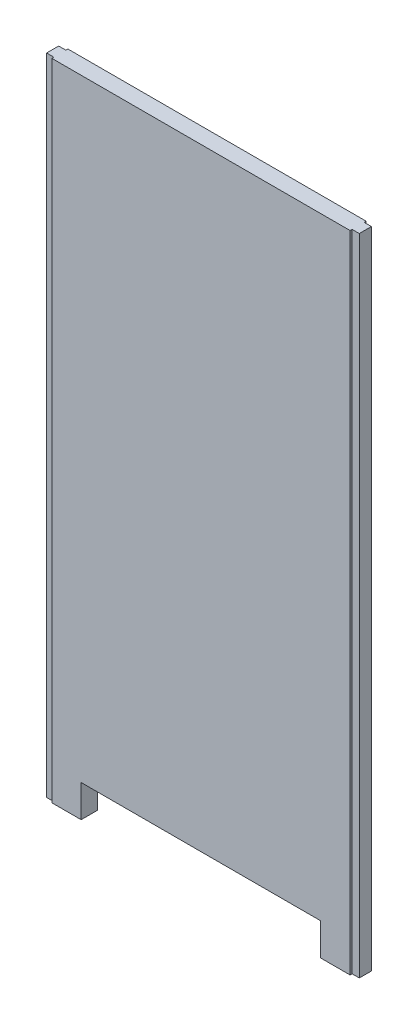
ISO-10303-21;
HEADER;
FILE_DESCRIPTION(('STEP AP214'),'2;1');
FILE_NAME('part.step','',(''),(''),'','','');
FILE_SCHEMA(('AUTOMOTIVE_DESIGN { 1 0 10303 214 1 1 1 1 }'));
ENDSEC;
DATA;
#1=APPLICATION_CONTEXT('core data for automotive mechanical design processes');
#2=APPLICATION_PROTOCOL_DEFINITION('international standard','automotive_design',2000,#1);
#3=PRODUCT_CONTEXT('',#1,'mechanical');
#4=PRODUCT('Part','Part','',(#3));
#5=PRODUCT_RELATED_PRODUCT_CATEGORY('part','',(#4));
#6=PRODUCT_DEFINITION_FORMATION('','',#4);
#7=PRODUCT_DEFINITION_CONTEXT('part definition',#1,'design');
#8=PRODUCT_DEFINITION('design','',#6,#7);
#9=PRODUCT_DEFINITION_SHAPE('','',#8);
#10=(LENGTH_UNIT() NAMED_UNIT(*) SI_UNIT(.MILLI.,.METRE.));
#11=(NAMED_UNIT(*) PLANE_ANGLE_UNIT() SI_UNIT($,.RADIAN.));
#12=(NAMED_UNIT(*) SI_UNIT($,.STERADIAN.) SOLID_ANGLE_UNIT());
#13=UNCERTAINTY_MEASURE_WITH_UNIT(LENGTH_MEASURE(1.E-05),#10,'distance_accuracy_value','');
#14=(GEOMETRIC_REPRESENTATION_CONTEXT(3) GLOBAL_UNCERTAINTY_ASSIGNED_CONTEXT((#13)) GLOBAL_UNIT_ASSIGNED_CONTEXT((#10,
#11,#12)) REPRESENTATION_CONTEXT('',''));
#15=CARTESIAN_POINT('',(0.,0.,0.));
#16=DIRECTION('',(0.,0.,1.));
#17=DIRECTION('',(1.,0.,0.));
#18=AXIS2_PLACEMENT_3D('',#15,#16,#17);
#19=CARTESIAN_POINT('',(0.,0.,2.));
#20=DIRECTION('',(0.,1.,0.));
#21=DIRECTION('',(0.,0.,1.));
#22=AXIS2_PLACEMENT_3D('',#19,#20,#21);
#23=PLANE('',#22);
#24=DIRECTION('',(0.,0.,1.));
#25=VECTOR('',#24,1.);
#26=CARTESIAN_POINT('',(33.3634572036821,0.,-29.9948235564531));
#27=LINE('',#26,#25);
#28=CARTESIAN_POINT('',(33.3634572036821,0.,0.));
#29=VERTEX_POINT('',#28);
#30=CARTESIAN_POINT('',(33.3634572036821,0.,2.));
#31=VERTEX_POINT('',#30);
#32=EDGE_CURVE('E160',#29,#31,#27,.T.);
#33=ORIENTED_EDGE('',*,*,#32,.F.);
#34=DIRECTION('',(1.,0.,0.));
#35=VECTOR('',#34,1.);
#36=CARTESIAN_POINT('',(0.,0.,0.));
#37=LINE('',#36,#35);
#38=CARTESIAN_POINT('',(37.,0.,0.));
#39=VERTEX_POINT('',#38);
#40=EDGE_CURVE('E173',#29,#39,#37,.T.);
#41=ORIENTED_EDGE('',*,*,#40,.T.);
#42=DIRECTION('',(0.,0.,-1.));
#43=VECTOR('',#42,1.);
#44=CARTESIAN_POINT('',(37.,0.,2.));
#45=LINE('',#44,#43);
#46=CARTESIAN_POINT('',(37.,0.,0.25));
#47=VERTEX_POINT('',#46);
#48=EDGE_CURVE('E212',#47,#39,#45,.T.);
#49=ORIENTED_EDGE('',*,*,#48,.F.);
#50=DIRECTION('',(1.,0.,0.));
#51=VECTOR('',#50,1.);
#52=CARTESIAN_POINT('',(0.,0.,0.250000000000009));
#53=LINE('',#52,#51);
#54=CARTESIAN_POINT('',(37.9,0.,0.25));
#55=VERTEX_POINT('',#54);
#56=EDGE_CURVE('E225',#47,#55,#53,.T.);
#57=ORIENTED_EDGE('',*,*,#56,.T.);
#58=DIRECTION('',(0.,0.,1.));
#59=VECTOR('',#58,1.);
#60=CARTESIAN_POINT('',(37.9,0.,0.));
#61=LINE('',#60,#59);
#62=CARTESIAN_POINT('',(37.9,0.,1.75));
#63=VERTEX_POINT('',#62);
#64=EDGE_CURVE('E228',#55,#63,#61,.T.);
#65=ORIENTED_EDGE('',*,*,#64,.T.);
#66=DIRECTION('',(1.,0.,0.));
#67=VECTOR('',#66,1.);
#68=CARTESIAN_POINT('',(0.,0.,1.74999999999999));
#69=LINE('',#68,#67);
#70=CARTESIAN_POINT('',(37.,0.,1.75));
#71=VERTEX_POINT('',#70);
#72=EDGE_CURVE('E233',#71,#63,#69,.T.);
#73=ORIENTED_EDGE('',*,*,#72,.F.);
#74=CARTESIAN_POINT('',(37.,0.,2.));
#75=VERTEX_POINT('',#74);
#76=EDGE_CURVE('E213',#75,#71,#45,.T.);
#77=ORIENTED_EDGE('',*,*,#76,.F.);
#78=DIRECTION('',(1.,0.,0.));
#79=VECTOR('',#78,1.);
#80=CARTESIAN_POINT('',(0.,0.,2.));
#81=LINE('',#80,#79);
#82=EDGE_CURVE('E176',#31,#75,#81,.T.);
#83=ORIENTED_EDGE('',*,*,#82,.F.);
#84=EDGE_LOOP('',(#33,#41,#49,#57,#65,#73,#77,#83));
#85=FACE_BOUND('',#84,.T.);
#86=ADVANCED_FACE('F41',(#85),#23,.F.);
#87=CARTESIAN_POINT('',(0.,0.,2.));
#88=DIRECTION('',(0.,0.,-1.));
#89=DIRECTION('',(-1.,0.,0.));
#90=AXIS2_PLACEMENT_3D('',#87,#88,#89);
#91=PLANE('',#90);
#92=DIRECTION('',(0.,-1.,0.));
#93=VECTOR('',#92,1.);
#94=CARTESIAN_POINT('',(33.3634572036821,4.,2.));
#95=LINE('',#94,#93);
#96=CARTESIAN_POINT('',(33.3634572036821,4.,2.));
#97=VERTEX_POINT('',#96);
#98=EDGE_CURVE('E346',#97,#31,#95,.T.);
#99=ORIENTED_EDGE('',*,*,#98,.T.);
#100=ORIENTED_EDGE('',*,*,#82,.T.);
#101=DIRECTION('',(0.,1.,0.));
#102=VECTOR('',#101,1.);
#103=CARTESIAN_POINT('',(37.,0.,2.));
#104=LINE('',#103,#102);
#105=CARTESIAN_POINT('',(37.,80.,2.));
#106=VERTEX_POINT('',#105);
#107=EDGE_CURVE('E310',#75,#106,#104,.T.);
#108=ORIENTED_EDGE('',*,*,#107,.T.);
#109=DIRECTION('',(-1.,0.,0.));
#110=VECTOR('',#109,1.);
#111=CARTESIAN_POINT('',(0.,80.,2.));
#112=LINE('',#111,#110);
#113=CARTESIAN_POINT('',(0.,80.,2.));
#114=VERTEX_POINT('',#113);
#115=EDGE_CURVE('E312',#106,#114,#112,.T.);
#116=ORIENTED_EDGE('',*,*,#115,.T.);
#117=DIRECTION('',(0.,-1.,0.));
#118=VECTOR('',#117,1.);
#119=CARTESIAN_POINT('',(0.,0.,2.));
#120=LINE('',#119,#118);
#121=CARTESIAN_POINT('',(0.,0.,2.));
#122=VERTEX_POINT('',#121);
#123=EDGE_CURVE('E202',#114,#122,#120,.T.);
#124=ORIENTED_EDGE('',*,*,#123,.T.);
#125=CARTESIAN_POINT('',(3.63654279631794,0.,2.));
#126=VERTEX_POINT('',#125);
#127=EDGE_CURVE('E306',#122,#126,#81,.T.);
#128=ORIENTED_EDGE('',*,*,#127,.T.);
#129=DIRECTION('',(0.,-1.,0.));
#130=VECTOR('',#129,1.);
#131=CARTESIAN_POINT('',(3.63654279631794,4.,2.));
#132=LINE('',#131,#130);
#133=CARTESIAN_POINT('',(3.63654279631794,4.,2.));
#134=VERTEX_POINT('',#133);
#135=EDGE_CURVE('E167',#134,#126,#132,.T.);
#136=ORIENTED_EDGE('',*,*,#135,.F.);
#137=DIRECTION('',(1.,0.,0.));
#138=VECTOR('',#137,1.);
#139=CARTESIAN_POINT('',(3.63654279631794,4.,2.));
#140=LINE('',#139,#138);
#141=EDGE_CURVE('E510',#134,#97,#140,.T.);
#142=ORIENTED_EDGE('',*,*,#141,.T.);
#143=EDGE_LOOP('',(#99,#100,#108,#116,#124,#128,#136,#142));
#144=FACE_BOUND('',#143,.T.);
#145=ADVANCED_FACE('F344',(#144),#91,.F.);
#146=CARTESIAN_POINT('',(0.,0.,0.));
#147=DIRECTION('',(0.,0.,-1.));
#148=DIRECTION('',(-1.,0.,0.));
#149=AXIS2_PLACEMENT_3D('',#146,#147,#148);
#150=PLANE('',#149);
#151=ORIENTED_EDGE('',*,*,#40,.F.);
#152=DIRECTION('',(0.,-1.,0.));
#153=VECTOR('',#152,1.);
#154=CARTESIAN_POINT('',(33.3634572036821,4.,0.));
#155=LINE('',#154,#153);
#156=CARTESIAN_POINT('',(33.3634572036821,4.,0.));
#157=VERTEX_POINT('',#156);
#158=EDGE_CURVE('E156',#157,#29,#155,.T.);
#159=ORIENTED_EDGE('',*,*,#158,.F.);
#160=DIRECTION('',(1.,0.,0.));
#161=VECTOR('',#160,1.);
#162=CARTESIAN_POINT('',(3.63654279631794,4.,0.));
#163=LINE('',#162,#161);
#164=CARTESIAN_POINT('',(3.63654279631794,4.,0.));
#165=VERTEX_POINT('',#164);
#166=EDGE_CURVE('E168',#165,#157,#163,.T.);
#167=ORIENTED_EDGE('',*,*,#166,.F.);
#168=DIRECTION('',(0.,-1.,0.));
#169=VECTOR('',#168,1.);
#170=CARTESIAN_POINT('',(3.63654279631794,4.,0.));
#171=LINE('',#170,#169);
#172=CARTESIAN_POINT('',(3.63654279631794,0.,0.));
#173=VERTEX_POINT('',#172);
#174=EDGE_CURVE('E253',#165,#173,#171,.T.);
#175=ORIENTED_EDGE('',*,*,#174,.T.);
#176=CARTESIAN_POINT('',(0.,0.,0.));
#177=VERTEX_POINT('',#176);
#178=EDGE_CURVE('E185',#177,#173,#37,.T.);
#179=ORIENTED_EDGE('',*,*,#178,.F.);
#180=DIRECTION('',(0.,-1.,0.));
#181=VECTOR('',#180,1.);
#182=CARTESIAN_POINT('',(0.,0.,0.));
#183=LINE('',#182,#181);
#184=CARTESIAN_POINT('',(0.,80.,0.));
#185=VERTEX_POINT('',#184);
#186=EDGE_CURVE('E186',#185,#177,#183,.T.);
#187=ORIENTED_EDGE('',*,*,#186,.F.);
#188=DIRECTION('',(-1.,0.,0.));
#189=VECTOR('',#188,1.);
#190=CARTESIAN_POINT('',(0.,80.,0.));
#191=LINE('',#190,#189);
#192=CARTESIAN_POINT('',(37.,80.,0.));
#193=VERTEX_POINT('',#192);
#194=EDGE_CURVE('E198',#193,#185,#191,.T.);
#195=ORIENTED_EDGE('',*,*,#194,.F.);
#196=DIRECTION('',(0.,1.,0.));
#197=VECTOR('',#196,1.);
#198=CARTESIAN_POINT('',(37.,0.,0.));
#199=LINE('',#198,#197);
#200=EDGE_CURVE('E183',#39,#193,#199,.T.);
#201=ORIENTED_EDGE('',*,*,#200,.F.);
#202=EDGE_LOOP('',(#151,#159,#167,#175,#179,#187,#195,#201));
#203=FACE_BOUND('',#202,.T.);
#204=ADVANCED_FACE('F180',(#203),#150,.T.);
#205=CARTESIAN_POINT('',(37.,0.,2.));
#206=DIRECTION('',(-1.,0.,0.));
#207=DIRECTION('',(0.,0.,1.));
#208=AXIS2_PLACEMENT_3D('',#205,#206,#207);
#209=PLANE('',#208);
#210=DIRECTION('',(0.,1.,0.));
#211=VECTOR('',#210,1.);
#212=CARTESIAN_POINT('',(37.,-1.74928556845358,0.25));
#213=LINE('',#212,#211);
#214=CARTESIAN_POINT('',(37.,80.,0.25));
#215=VERTEX_POINT('',#214);
#216=EDGE_CURVE('E224',#47,#215,#213,.T.);
#217=ORIENTED_EDGE('',*,*,#216,.F.);
#218=ORIENTED_EDGE('',*,*,#48,.T.);
#219=ORIENTED_EDGE('',*,*,#200,.T.);
#220=DIRECTION('',(0.,0.,-1.));
#221=VECTOR('',#220,1.);
#222=CARTESIAN_POINT('',(37.,80.,2.));
#223=LINE('',#222,#221);
#224=EDGE_CURVE('E207',#215,#193,#223,.T.);
#225=ORIENTED_EDGE('',*,*,#224,.F.);
#226=EDGE_LOOP('',(#217,#218,#219,#225));
#227=FACE_BOUND('',#226,.T.);
#228=ADVANCED_FACE('F222',(#227),#209,.F.);
#229=CARTESIAN_POINT('',(0.,0.,2.));
#230=DIRECTION('',(1.,0.,0.));
#231=DIRECTION('',(0.,0.,-1.));
#232=AXIS2_PLACEMENT_3D('',#229,#230,#231);
#233=PLANE('',#232);
#234=DIRECTION('',(0.,1.,0.));
#235=VECTOR('',#234,1.);
#236=CARTESIAN_POINT('',(0.,-1.74928556845358,1.75));
#237=LINE('',#236,#235);
#238=CARTESIAN_POINT('',(0.,0.,1.75));
#239=VERTEX_POINT('',#238);
#240=CARTESIAN_POINT('',(0.,80.,1.75));
#241=VERTEX_POINT('',#240);
#242=EDGE_CURVE('E292',#239,#241,#237,.T.);
#243=ORIENTED_EDGE('',*,*,#242,.F.);
#244=DIRECTION('',(0.,0.,-1.));
#245=VECTOR('',#244,1.);
#246=CARTESIAN_POINT('',(0.,0.,2.));
#247=LINE('',#246,#245);
#248=EDGE_CURVE('E11',#122,#239,#247,.T.);
#249=ORIENTED_EDGE('',*,*,#248,.F.);
#250=ORIENTED_EDGE('',*,*,#123,.F.);
#251=DIRECTION('',(0.,0.,-1.));
#252=VECTOR('',#251,1.);
#253=CARTESIAN_POINT('',(0.,80.,2.));
#254=LINE('',#253,#252);
#255=EDGE_CURVE('E203',#114,#241,#254,.T.);
#256=ORIENTED_EDGE('',*,*,#255,.T.);
#257=EDGE_LOOP('',(#243,#249,#250,#256));
#258=FACE_BOUND('',#257,.T.);
#259=ADVANCED_FACE('F341',(#258),#233,.F.);
#260=CARTESIAN_POINT('',(0.,0.,0.25));
#261=VERTEX_POINT('',#260);
#262=EDGE_CURVE('E50',#261,#177,#247,.T.);
#263=ORIENTED_EDGE('',*,*,#262,.F.);
#264=DIRECTION('',(0.,1.,0.));
#265=VECTOR('',#264,1.);
#266=CARTESIAN_POINT('',(0.,-1.74928556845358,0.25));
#267=LINE('',#266,#265);
#268=CARTESIAN_POINT('',(0.,80.,0.25));
#269=VERTEX_POINT('',#268);
#270=EDGE_CURVE('E288',#261,#269,#267,.T.);
#271=ORIENTED_EDGE('',*,*,#270,.T.);
#272=EDGE_CURVE('E208',#269,#185,#254,.T.);
#273=ORIENTED_EDGE('',*,*,#272,.T.);
#274=ORIENTED_EDGE('',*,*,#186,.T.);
#275=EDGE_LOOP('',(#263,#271,#273,#274));
#276=FACE_BOUND('',#275,.T.);
#277=ADVANCED_FACE('F43',(#276),#233,.F.);
#278=ORIENTED_EDGE('',*,*,#178,.T.);
#279=DIRECTION('',(0.,0.,1.));
#280=VECTOR('',#279,1.);
#281=CARTESIAN_POINT('',(3.63654279631794,0.,-29.9948235564531));
#282=LINE('',#281,#280);
#283=EDGE_CURVE('E57',#173,#126,#282,.T.);
#284=ORIENTED_EDGE('',*,*,#283,.T.);
#285=ORIENTED_EDGE('',*,*,#127,.F.);
#286=ORIENTED_EDGE('',*,*,#248,.T.);
#287=DIRECTION('',(-1.,0.,0.));
#288=VECTOR('',#287,1.);
#289=CARTESIAN_POINT('',(0.,0.,1.75));
#290=LINE('',#289,#288);
#291=CARTESIAN_POINT('',(-0.9,0.,1.75));
#292=VERTEX_POINT('',#291);
#293=EDGE_CURVE('E270',#239,#292,#290,.T.);
#294=ORIENTED_EDGE('',*,*,#293,.T.);
#295=DIRECTION('',(0.,0.,1.));
#296=VECTOR('',#295,1.);
#297=CARTESIAN_POINT('',(-0.9,0.,0.));
#298=LINE('',#297,#296);
#299=CARTESIAN_POINT('',(-0.9,0.,0.25));
#300=VERTEX_POINT('',#299);
#301=EDGE_CURVE('E273',#300,#292,#298,.T.);
#302=ORIENTED_EDGE('',*,*,#301,.F.);
#303=DIRECTION('',(-1.,0.,0.));
#304=VECTOR('',#303,1.);
#305=CARTESIAN_POINT('',(0.,0.,0.25));
#306=LINE('',#305,#304);
#307=EDGE_CURVE('E192',#261,#300,#306,.T.);
#308=ORIENTED_EDGE('',*,*,#307,.F.);
#309=ORIENTED_EDGE('',*,*,#262,.T.);
#310=EDGE_LOOP('',(#278,#284,#285,#286,#294,#302,#308,#309));
#311=FACE_BOUND('',#310,.T.);
#312=ADVANCED_FACE('F328',(#311),#23,.F.);
#313=ORIENTED_EDGE('',*,*,#76,.T.);
#314=DIRECTION('',(0.,1.,0.));
#315=VECTOR('',#314,1.);
#316=CARTESIAN_POINT('',(37.,-1.74928556845358,1.75));
#317=LINE('',#316,#315);
#318=CARTESIAN_POINT('',(37.,80.,1.75));
#319=VERTEX_POINT('',#318);
#320=EDGE_CURVE('E232',#71,#319,#317,.T.);
#321=ORIENTED_EDGE('',*,*,#320,.T.);
#322=EDGE_CURVE('E209',#106,#319,#223,.T.);
#323=ORIENTED_EDGE('',*,*,#322,.F.);
#324=ORIENTED_EDGE('',*,*,#107,.F.);
#325=EDGE_LOOP('',(#313,#321,#323,#324));
#326=FACE_BOUND('',#325,.T.);
#327=ADVANCED_FACE('F361',(#326),#209,.F.);
#328=CARTESIAN_POINT('',(0.,80.,2.));
#329=DIRECTION('',(0.,-1.,0.));
#330=DIRECTION('',(0.,0.,-1.));
#331=AXIS2_PLACEMENT_3D('',#328,#329,#330);
#332=PLANE('',#331);
#333=ORIENTED_EDGE('',*,*,#194,.T.);
#334=ORIENTED_EDGE('',*,*,#272,.F.);
#335=DIRECTION('',(1.,0.,0.));
#336=VECTOR('',#335,1.);
#337=CARTESIAN_POINT('',(0.,80.,0.25));
#338=LINE('',#337,#336);
#339=CARTESIAN_POINT('',(-0.9,80.,0.25));
#340=VERTEX_POINT('',#339);
#341=EDGE_CURVE('E268',#340,#269,#338,.T.);
#342=ORIENTED_EDGE('',*,*,#341,.F.);
#343=DIRECTION('',(0.,0.,-1.));
#344=VECTOR('',#343,1.);
#345=CARTESIAN_POINT('',(-0.9,80.,0.));
#346=LINE('',#345,#344);
#347=CARTESIAN_POINT('',(-0.9,80.,1.75));
#348=VERTEX_POINT('',#347);
#349=EDGE_CURVE('E279',#348,#340,#346,.T.);
#350=ORIENTED_EDGE('',*,*,#349,.F.);
#351=DIRECTION('',(1.,0.,0.));
#352=VECTOR('',#351,1.);
#353=CARTESIAN_POINT('',(0.,80.,1.75));
#354=LINE('',#353,#352);
#355=EDGE_CURVE('E283',#348,#241,#354,.T.);
#356=ORIENTED_EDGE('',*,*,#355,.T.);
#357=ORIENTED_EDGE('',*,*,#255,.F.);
#358=ORIENTED_EDGE('',*,*,#115,.F.);
#359=ORIENTED_EDGE('',*,*,#322,.T.);
#360=DIRECTION('',(-1.,0.,0.));
#361=VECTOR('',#360,1.);
#362=CARTESIAN_POINT('',(0.,80.,1.74999999999999));
#363=LINE('',#362,#361);
#364=CARTESIAN_POINT('',(37.9,80.,1.75));
#365=VERTEX_POINT('',#364);
#366=EDGE_CURVE('E65',#365,#319,#363,.T.);
#367=ORIENTED_EDGE('',*,*,#366,.F.);
#368=DIRECTION('',(0.,0.,-1.));
#369=VECTOR('',#368,1.);
#370=CARTESIAN_POINT('',(37.9,80.,0.));
#371=LINE('',#370,#369);
#372=CARTESIAN_POINT('',(37.9,80.,0.25));
#373=VERTEX_POINT('',#372);
#374=EDGE_CURVE('E264',#365,#373,#371,.T.);
#375=ORIENTED_EDGE('',*,*,#374,.T.);
#376=DIRECTION('',(-1.,0.,0.));
#377=VECTOR('',#376,1.);
#378=CARTESIAN_POINT('',(0.,80.,0.250000000000009));
#379=LINE('',#378,#377);
#380=EDGE_CURVE('E239',#373,#215,#379,.T.);
#381=ORIENTED_EDGE('',*,*,#380,.T.);
#382=ORIENTED_EDGE('',*,*,#224,.T.);
#383=EDGE_LOOP('',(#333,#334,#342,#350,#356,#357,#358,#359,#367,#375,#381,#382));
#384=FACE_BOUND('',#383,.T.);
#385=ADVANCED_FACE('F325',(#384),#332,.F.);
#386=CARTESIAN_POINT('',(-0.9,-1.74928556845358,0.));
#387=DIRECTION('',(1.,0.,0.));
#388=DIRECTION('',(0.,0.,-1.));
#389=AXIS2_PLACEMENT_3D('',#386,#387,#388);
#390=PLANE('',#389);
#391=DIRECTION('',(0.,1.,0.));
#392=VECTOR('',#391,1.);
#393=CARTESIAN_POINT('',(-0.9,-1.74928556845358,0.25));
#394=LINE('',#393,#392);
#395=EDGE_CURVE('E287',#300,#340,#394,.T.);
#396=ORIENTED_EDGE('',*,*,#395,.F.);
#397=ORIENTED_EDGE('',*,*,#301,.T.);
#398=DIRECTION('',(0.,1.,0.));
#399=VECTOR('',#398,1.);
#400=CARTESIAN_POINT('',(-0.9,-1.74928556845358,1.75));
#401=LINE('',#400,#399);
#402=EDGE_CURVE('E295',#292,#348,#401,.T.);
#403=ORIENTED_EDGE('',*,*,#402,.T.);
#404=ORIENTED_EDGE('',*,*,#349,.T.);
#405=EDGE_LOOP('',(#396,#397,#403,#404));
#406=FACE_BOUND('',#405,.T.);
#407=ADVANCED_FACE('F360',(#406),#390,.F.);
#408=CARTESIAN_POINT('',(0.,-1.74928556845358,1.75));
#409=DIRECTION('',(0.,0.,1.));
#410=DIRECTION('',(1.,0.,0.));
#411=AXIS2_PLACEMENT_3D('',#408,#409,#410);
#412=PLANE('',#411);
#413=ORIENTED_EDGE('',*,*,#293,.F.);
#414=ORIENTED_EDGE('',*,*,#242,.T.);
#415=ORIENTED_EDGE('',*,*,#355,.F.);
#416=ORIENTED_EDGE('',*,*,#402,.F.);
#417=EDGE_LOOP('',(#413,#414,#415,#416));
#418=FACE_BOUND('',#417,.T.);
#419=ADVANCED_FACE('F337',(#418),#412,.T.);
#420=CARTESIAN_POINT('',(0.,-1.74928556845358,0.25));
#421=DIRECTION('',(0.,0.,1.));
#422=DIRECTION('',(1.,0.,0.));
#423=AXIS2_PLACEMENT_3D('',#420,#421,#422);
#424=PLANE('',#423);
#425=ORIENTED_EDGE('',*,*,#270,.F.);
#426=ORIENTED_EDGE('',*,*,#307,.T.);
#427=ORIENTED_EDGE('',*,*,#395,.T.);
#428=ORIENTED_EDGE('',*,*,#341,.T.);
#429=EDGE_LOOP('',(#425,#426,#427,#428));
#430=FACE_BOUND('',#429,.T.);
#431=ADVANCED_FACE('F331',(#430),#424,.F.);
#432=CARTESIAN_POINT('',(0.,-1.74928556845358,1.74999999999999));
#433=DIRECTION('',(0.,0.,-1.));
#434=DIRECTION('',(-1.,0.,0.));
#435=AXIS2_PLACEMENT_3D('',#432,#433,#434);
#436=PLANE('',#435);
#437=ORIENTED_EDGE('',*,*,#320,.F.);
#438=ORIENTED_EDGE('',*,*,#72,.T.);
#439=DIRECTION('',(0.,1.,0.));
#440=VECTOR('',#439,1.);
#441=CARTESIAN_POINT('',(37.9,-1.74928556845358,1.75));
#442=LINE('',#441,#440);
#443=EDGE_CURVE('E244',#63,#365,#442,.T.);
#444=ORIENTED_EDGE('',*,*,#443,.T.);
#445=ORIENTED_EDGE('',*,*,#366,.T.);
#446=EDGE_LOOP('',(#437,#438,#444,#445));
#447=FACE_BOUND('',#446,.T.);
#448=ADVANCED_FACE('F414',(#447),#436,.F.);
#449=CARTESIAN_POINT('',(0.,-1.74928556845358,0.250000000000009));
#450=DIRECTION('',(0.,0.,-1.));
#451=DIRECTION('',(-1.,0.,0.));
#452=AXIS2_PLACEMENT_3D('',#449,#450,#451);
#453=PLANE('',#452);
#454=ORIENTED_EDGE('',*,*,#56,.F.);
#455=ORIENTED_EDGE('',*,*,#216,.T.);
#456=ORIENTED_EDGE('',*,*,#380,.F.);
#457=DIRECTION('',(0.,1.,0.));
#458=VECTOR('',#457,1.);
#459=CARTESIAN_POINT('',(37.9,-1.74928556845358,0.25));
#460=LINE('',#459,#458);
#461=EDGE_CURVE('E236',#55,#373,#460,.T.);
#462=ORIENTED_EDGE('',*,*,#461,.F.);
#463=EDGE_LOOP('',(#454,#455,#456,#462));
#464=FACE_BOUND('',#463,.T.);
#465=ADVANCED_FACE('F237',(#464),#453,.T.);
#466=CARTESIAN_POINT('',(37.9,-1.74928556845358,0.));
#467=DIRECTION('',(1.,0.,0.));
#468=DIRECTION('',(0.,0.,-1.));
#469=AXIS2_PLACEMENT_3D('',#466,#467,#468);
#470=PLANE('',#469);
#471=ORIENTED_EDGE('',*,*,#64,.F.);
#472=ORIENTED_EDGE('',*,*,#461,.T.);
#473=ORIENTED_EDGE('',*,*,#374,.F.);
#474=ORIENTED_EDGE('',*,*,#443,.F.);
#475=EDGE_LOOP('',(#471,#472,#473,#474));
#476=FACE_BOUND('',#475,.T.);
#477=ADVANCED_FACE('F247',(#476),#470,.T.);
#478=CARTESIAN_POINT('',(33.3634572036821,4.,-29.9948235564531));
#479=DIRECTION('',(-1.,0.,0.));
#480=DIRECTION('',(0.,0.,1.));
#481=AXIS2_PLACEMENT_3D('',#478,#479,#480);
#482=PLANE('',#481);
#483=ORIENTED_EDGE('',*,*,#158,.T.);
#484=ORIENTED_EDGE('',*,*,#32,.T.);
#485=ORIENTED_EDGE('',*,*,#98,.F.);
#486=DIRECTION('',(0.,0.,1.));
#487=VECTOR('',#486,1.);
#488=CARTESIAN_POINT('',(33.3634572036821,4.,-29.9948235564531));
#489=LINE('',#488,#487);
#490=EDGE_CURVE('E162',#157,#97,#489,.T.);
#491=ORIENTED_EDGE('',*,*,#490,.F.);
#492=EDGE_LOOP('',(#483,#484,#485,#491));
#493=FACE_BOUND('',#492,.T.);
#494=ADVANCED_FACE('F158',(#493),#482,.T.);
#495=CARTESIAN_POINT('',(3.63654279631794,4.,-29.9948235564531));
#496=DIRECTION('',(0.,-1.,0.));
#497=DIRECTION('',(0.,0.,-1.));
#498=AXIS2_PLACEMENT_3D('',#495,#496,#497);
#499=PLANE('',#498);
#500=ORIENTED_EDGE('',*,*,#166,.T.);
#501=ORIENTED_EDGE('',*,*,#490,.T.);
#502=ORIENTED_EDGE('',*,*,#141,.F.);
#503=DIRECTION('',(0.,0.,1.));
#504=VECTOR('',#503,1.);
#505=CARTESIAN_POINT('',(3.63654279631794,4.,-29.9948235564531));
#506=LINE('',#505,#504);
#507=EDGE_CURVE('E507',#165,#134,#506,.T.);
#508=ORIENTED_EDGE('',*,*,#507,.F.);
#509=EDGE_LOOP('',(#500,#501,#502,#508));
#510=FACE_BOUND('',#509,.T.);
#511=ADVANCED_FACE('F484',(#510),#499,.T.);
#512=CARTESIAN_POINT('',(3.63654279631794,4.,-29.9948235564531));
#513=DIRECTION('',(-1.,0.,0.));
#514=DIRECTION('',(0.,-1.,0.));
#515=AXIS2_PLACEMENT_3D('',#512,#513,#514);
#516=PLANE('',#515);
#517=ORIENTED_EDGE('',*,*,#507,.T.);
#518=ORIENTED_EDGE('',*,*,#135,.T.);
#519=ORIENTED_EDGE('',*,*,#283,.F.);
#520=ORIENTED_EDGE('',*,*,#174,.F.);
#521=EDGE_LOOP('',(#517,#518,#519,#520));
#522=FACE_BOUND('',#521,.T.);
#523=ADVANCED_FACE('F493',(#522),#516,.F.);
#524=CLOSED_SHELL('',(#86,#145,#204,#228,#259,#277,#312,#327,#385,#407,#419,#431,#448,#465,#477,
#494,#511,#523));
#525=MANIFOLD_SOLID_BREP('B2',#524);
#526=ADVANCED_BREP_SHAPE_REPRESENTATION('',(#18,#525),#14);
#527=SHAPE_DEFINITION_REPRESENTATION(#9,#526);
ENDSEC;
END-ISO-10303-21;
